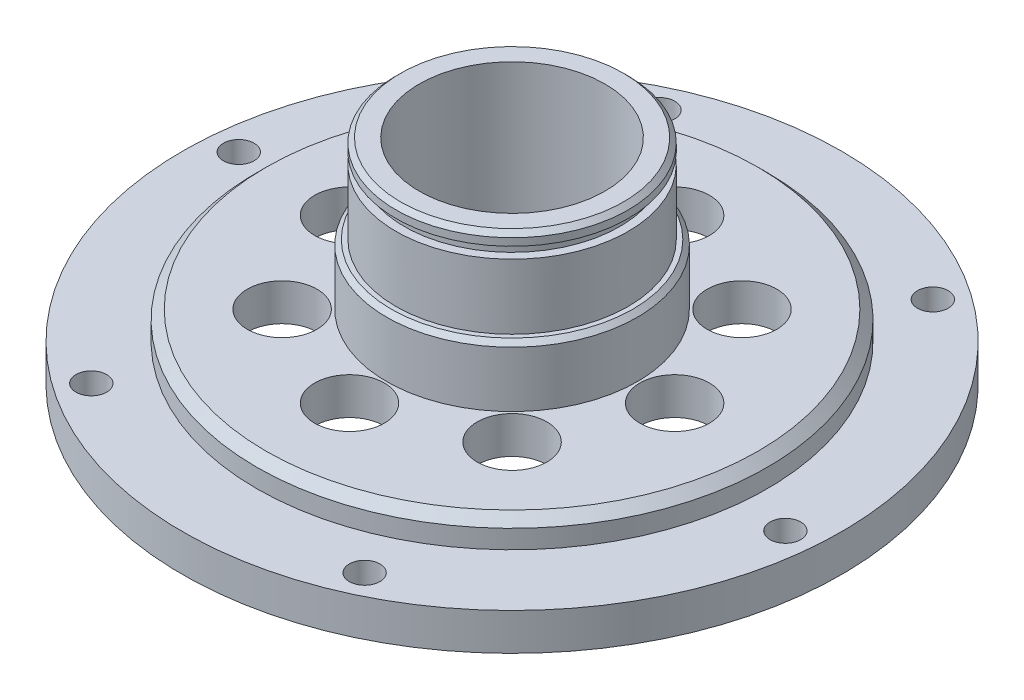
ISO-10303-21;
HEADER;
FILE_DESCRIPTION(('STEP AP214'),'2;1');
FILE_NAME('part.step','',(''),(''),'','','');
FILE_SCHEMA(('AUTOMOTIVE_DESIGN { 1 0 10303 214 1 1 1 1 }'));
ENDSEC;
DATA;
#1=APPLICATION_CONTEXT('core data for automotive mechanical design processes');
#2=APPLICATION_PROTOCOL_DEFINITION('international standard','automotive_design',2000,#1);
#3=PRODUCT_CONTEXT('',#1,'mechanical');
#4=PRODUCT('Part','Part','',(#3));
#5=PRODUCT_RELATED_PRODUCT_CATEGORY('part','',(#4));
#6=PRODUCT_DEFINITION_FORMATION('','',#4);
#7=PRODUCT_DEFINITION_CONTEXT('part definition',#1,'design');
#8=PRODUCT_DEFINITION('design','',#6,#7);
#9=PRODUCT_DEFINITION_SHAPE('','',#8);
#10=(LENGTH_UNIT() NAMED_UNIT(*) SI_UNIT(.MILLI.,.METRE.));
#11=(NAMED_UNIT(*) PLANE_ANGLE_UNIT() SI_UNIT($,.RADIAN.));
#12=(NAMED_UNIT(*) SI_UNIT($,.STERADIAN.) SOLID_ANGLE_UNIT());
#13=UNCERTAINTY_MEASURE_WITH_UNIT(LENGTH_MEASURE(1.E-05),#10,'distance_accuracy_value','');
#14=(GEOMETRIC_REPRESENTATION_CONTEXT(3) GLOBAL_UNCERTAINTY_ASSIGNED_CONTEXT((#13)) GLOBAL_UNIT_ASSIGNED_CONTEXT((#10,
#11,#12)) REPRESENTATION_CONTEXT('',''));
#15=CARTESIAN_POINT('',(0.,0.,0.));
#16=DIRECTION('',(0.,0.,1.));
#17=DIRECTION('',(1.,0.,0.));
#18=AXIS2_PLACEMENT_3D('',#15,#16,#17);
#19=CARTESIAN_POINT('',(-12.5,7.,0.));
#20=DIRECTION('',(0.,-1.,0.));
#21=DIRECTION('',(0.,0.,-1.));
#22=AXIS2_PLACEMENT_3D('',#19,#20,#21);
#23=PLANE('',#22);
#24=CARTESIAN_POINT('',(0.,7.,-17.5));
#25=DIRECTION('',(0.,1.,0.));
#26=DIRECTION('',(0.,0.,1.));
#27=AXIS2_PLACEMENT_3D('',#24,#25,#26);
#28=CIRCLE('',#27,3.75);
#29=CARTESIAN_POINT('',(0.,7.,-13.75));
#30=VERTEX_POINT('',#29);
#31=EDGE_CURVE('E116',#30,#30,#28,.T.);
#32=ORIENTED_EDGE('',*,*,#31,.F.);
#33=EDGE_LOOP('',(#32));
#34=FACE_BOUND('',#33,.T.);
#35=CARTESIAN_POINT('',(12.3743686707646,7.,-12.3743686707646));
#36=DIRECTION('',(0.,1.,0.));
#37=DIRECTION('',(0.,0.,1.));
#38=AXIS2_PLACEMENT_3D('',#35,#36,#37);
#39=CIRCLE('',#38,3.75);
#40=CARTESIAN_POINT('',(12.3743686707646,7.,-8.62436867076459));
#41=VERTEX_POINT('',#40);
#42=EDGE_CURVE('E119',#41,#41,#39,.T.);
#43=ORIENTED_EDGE('',*,*,#42,.F.);
#44=EDGE_LOOP('',(#43));
#45=FACE_BOUND('',#44,.T.);
#46=CARTESIAN_POINT('',(17.5,7.,0.));
#47=DIRECTION('',(0.,1.,0.));
#48=DIRECTION('',(0.,0.,1.));
#49=AXIS2_PLACEMENT_3D('',#46,#47,#48);
#50=CIRCLE('',#49,3.75);
#51=CARTESIAN_POINT('',(17.5,7.,3.75));
#52=VERTEX_POINT('',#51);
#53=EDGE_CURVE('E136',#52,#52,#50,.T.);
#54=ORIENTED_EDGE('',*,*,#53,.F.);
#55=EDGE_LOOP('',(#54));
#56=FACE_BOUND('',#55,.T.);
#57=CARTESIAN_POINT('',(12.3743686707646,7.,12.3743686707646));
#58=DIRECTION('',(0.,1.,0.));
#59=DIRECTION('',(0.,0.,1.));
#60=AXIS2_PLACEMENT_3D('',#57,#58,#59);
#61=CIRCLE('',#60,3.75);
#62=CARTESIAN_POINT('',(12.3743686707646,7.,16.1243686707646));
#63=VERTEX_POINT('',#62);
#64=EDGE_CURVE('E133',#63,#63,#61,.T.);
#65=ORIENTED_EDGE('',*,*,#64,.F.);
#66=EDGE_LOOP('',(#65));
#67=FACE_BOUND('',#66,.T.);
#68=CARTESIAN_POINT('',(0.,7.,17.5));
#69=DIRECTION('',(0.,1.,0.));
#70=DIRECTION('',(0.,0.,1.));
#71=AXIS2_PLACEMENT_3D('',#68,#69,#70);
#72=CIRCLE('',#71,3.75);
#73=CARTESIAN_POINT('',(0.,7.,21.25));
#74=VERTEX_POINT('',#73);
#75=EDGE_CURVE('E130',#74,#74,#72,.T.);
#76=ORIENTED_EDGE('',*,*,#75,.F.);
#77=EDGE_LOOP('',(#76));
#78=FACE_BOUND('',#77,.T.);
#79=CARTESIAN_POINT('',(-12.3743686707646,7.,12.3743686707646));
#80=DIRECTION('',(0.,1.,0.));
#81=DIRECTION('',(0.,0.,1.));
#82=AXIS2_PLACEMENT_3D('',#79,#80,#81);
#83=CIRCLE('',#82,3.75);
#84=CARTESIAN_POINT('',(-12.3743686707646,7.,16.1243686707646));
#85=VERTEX_POINT('',#84);
#86=EDGE_CURVE('E127',#85,#85,#83,.T.);
#87=ORIENTED_EDGE('',*,*,#86,.F.);
#88=EDGE_LOOP('',(#87));
#89=FACE_BOUND('',#88,.T.);
#90=CARTESIAN_POINT('',(-17.5,7.,0.));
#91=DIRECTION('',(0.,1.,0.));
#92=DIRECTION('',(0.,0.,1.));
#93=AXIS2_PLACEMENT_3D('',#90,#91,#92);
#94=CIRCLE('',#93,3.75);
#95=CARTESIAN_POINT('',(-17.5,7.,3.75));
#96=VERTEX_POINT('',#95);
#97=EDGE_CURVE('E123',#96,#96,#94,.T.);
#98=ORIENTED_EDGE('',*,*,#97,.F.);
#99=EDGE_LOOP('',(#98));
#100=FACE_BOUND('',#99,.T.);
#101=CARTESIAN_POINT('',(-12.3743686707646,7.,-12.3743686707646));
#102=DIRECTION('',(0.,1.,0.));
#103=DIRECTION('',(0.,0.,1.));
#104=AXIS2_PLACEMENT_3D('',#101,#102,#103);
#105=CIRCLE('',#104,3.75);
#106=CARTESIAN_POINT('',(-12.3743686707646,7.,-8.62436867076458));
#107=VERTEX_POINT('',#106);
#108=EDGE_CURVE('E120',#107,#107,#105,.T.);
#109=ORIENTED_EDGE('',*,*,#108,.F.);
#110=EDGE_LOOP('',(#109));
#111=FACE_BOUND('',#110,.T.);
#112=CARTESIAN_POINT('',(0.,7.,0.));
#113=DIRECTION('',(0.,-1.,0.));
#114=DIRECTION('',(0.,0.,-1.));
#115=AXIS2_PLACEMENT_3D('',#112,#113,#114);
#116=CIRCLE('',#115,26.475);
#117=CARTESIAN_POINT('',(0.,7.,-26.475));
#118=VERTEX_POINT('',#117);
#119=EDGE_CURVE('E62',#118,#118,#116,.F.);
#120=ORIENTED_EDGE('',*,*,#119,.T.);
#121=EDGE_LOOP('',(#120));
#122=FACE_BOUND('',#121,.T.);
#123=CARTESIAN_POINT('',(0.,7.,0.));
#124=DIRECTION('',(0.,-1.,0.));
#125=DIRECTION('',(0.,0.,-1.));
#126=AXIS2_PLACEMENT_3D('',#123,#124,#125);
#127=CIRCLE('',#126,13.5);
#128=CARTESIAN_POINT('',(0.,7.,-13.5));
#129=VERTEX_POINT('',#128);
#130=EDGE_CURVE('E50',#129,#129,#127,.F.);
#131=ORIENTED_EDGE('',*,*,#130,.F.);
#132=EDGE_LOOP('',(#131));
#133=FACE_BOUND('',#132,.T.);
#134=ADVANCED_FACE('F38',(#34,#45,#56,#67,#78,#89,#100,#111,#122,#133),#23,.F.);
#135=CARTESIAN_POINT('',(0.,0.,0.));
#136=DIRECTION('',(0.,-1.,0.));
#137=DIRECTION('',(0.,0.,-1.));
#138=AXIS2_PLACEMENT_3D('',#135,#136,#137);
#139=CYLINDRICAL_SURFACE('',#138,12.5);
#140=CARTESIAN_POINT('',(0.,22.5,0.));
#141=DIRECTION('',(0.,-1.,0.));
#142=DIRECTION('',(0.,0.,-1.));
#143=AXIS2_PLACEMENT_3D('',#140,#141,#142);
#144=CIRCLE('',#143,12.5);
#145=CARTESIAN_POINT('',(0.,22.5,-12.5));
#146=VERTEX_POINT('',#145);
#147=EDGE_CURVE('E59',#146,#146,#144,.T.);
#148=ORIENTED_EDGE('',*,*,#147,.T.);
#149=EDGE_LOOP('',(#148));
#150=FACE_BOUND('',#149,.T.);
#151=CARTESIAN_POINT('',(0.,21.7,0.));
#152=DIRECTION('',(0.,-1.,0.));
#153=DIRECTION('',(0.,0.,-1.));
#154=AXIS2_PLACEMENT_3D('',#151,#152,#153);
#155=CIRCLE('',#154,12.5);
#156=CARTESIAN_POINT('',(0.,21.7,-12.5));
#157=VERTEX_POINT('',#156);
#158=EDGE_CURVE('E124',#157,#157,#155,.T.);
#159=ORIENTED_EDGE('',*,*,#158,.F.);
#160=EDGE_LOOP('',(#159));
#161=FACE_BOUND('',#160,.T.);
#162=ADVANCED_FACE('F209',(#150,#161),#139,.T.);
#163=CARTESIAN_POINT('',(0.,0.,0.));
#164=DIRECTION('',(0.,-1.,0.));
#165=DIRECTION('',(0.,0.,-1.));
#166=AXIS2_PLACEMENT_3D('',#163,#164,#165);
#167=CYLINDRICAL_SURFACE('',#166,35.475);
#168=CARTESIAN_POINT('',(0.,0.,0.));
#169=DIRECTION('',(0.,-1.,0.));
#170=DIRECTION('',(0.,0.,-1.));
#171=AXIS2_PLACEMENT_3D('',#168,#169,#170);
#172=CIRCLE('',#171,35.475);
#173=CARTESIAN_POINT('',(0.,0.,-35.475));
#174=VERTEX_POINT('',#173);
#175=EDGE_CURVE('E74',#174,#174,#172,.T.);
#176=ORIENTED_EDGE('',*,*,#175,.F.);
#177=EDGE_LOOP('',(#176));
#178=FACE_BOUND('',#177,.T.);
#179=CARTESIAN_POINT('',(0.,4.,0.));
#180=DIRECTION('',(0.,-1.,0.));
#181=DIRECTION('',(0.,0.,-1.));
#182=AXIS2_PLACEMENT_3D('',#179,#180,#181);
#183=CIRCLE('',#182,35.475);
#184=CARTESIAN_POINT('',(0.,4.,-35.475));
#185=VERTEX_POINT('',#184);
#186=EDGE_CURVE('E89',#185,#185,#183,.T.);
#187=ORIENTED_EDGE('',*,*,#186,.T.);
#188=EDGE_LOOP('',(#187));
#189=FACE_BOUND('',#188,.T.);
#190=ADVANCED_FACE('F215',(#178,#189),#167,.T.);
#191=CARTESIAN_POINT('',(-35.475,0.,0.));
#192=DIRECTION('',(0.,1.,0.));
#193=DIRECTION('',(0.,0.,1.));
#194=AXIS2_PLACEMENT_3D('',#191,#192,#193);
#195=PLANE('',#194);
#196=CARTESIAN_POINT('',(-13.6313857115531,0.,-29.503140910467));
#197=DIRECTION('',(0.,1.,0.));
#198=DIRECTION('',(0.,0.,1.));
#199=AXIS2_PLACEMENT_3D('',#196,#197,#198);
#200=CIRCLE('',#199,1.65);
#201=CARTESIAN_POINT('',(-13.6313857115531,0.,-27.853140910467));
#202=VERTEX_POINT('',#201);
#203=EDGE_CURVE('E182',#202,#202,#200,.T.);
#204=ORIENTED_EDGE('',*,*,#203,.T.);
#205=EDGE_LOOP('',(#204));
#206=FACE_BOUND('',#205,.T.);
#207=CARTESIAN_POINT('',(-32.3661623756729,0.,-2.9464441402442));
#208=DIRECTION('',(0.,1.,0.));
#209=DIRECTION('',(0.,0.,1.));
#210=AXIS2_PLACEMENT_3D('',#207,#208,#209);
#211=CIRCLE('',#210,1.65);
#212=CARTESIAN_POINT('',(-32.3661623756729,0.,-1.2964441402442));
#213=VERTEX_POINT('',#212);
#214=EDGE_CURVE('E176',#213,#213,#211,.T.);
#215=ORIENTED_EDGE('',*,*,#214,.T.);
#216=EDGE_LOOP('',(#215));
#217=FACE_BOUND('',#216,.T.);
#218=CARTESIAN_POINT('',(-18.7347766641195,0.,26.5566967702229));
#219=DIRECTION('',(0.,1.,0.));
#220=DIRECTION('',(0.,0.,1.));
#221=AXIS2_PLACEMENT_3D('',#218,#219,#220);
#222=CIRCLE('',#221,1.65);
#223=CARTESIAN_POINT('',(-18.7347766641195,0.,28.2066967702229));
#224=VERTEX_POINT('',#223);
#225=EDGE_CURVE('E170',#224,#224,#222,.T.);
#226=ORIENTED_EDGE('',*,*,#225,.T.);
#227=EDGE_LOOP('',(#226));
#228=FACE_BOUND('',#227,.T.);
#229=CARTESIAN_POINT('',(13.6313857115533,0.,29.5031409104669));
#230=DIRECTION('',(0.,1.,0.));
#231=DIRECTION('',(0.,0.,1.));
#232=AXIS2_PLACEMENT_3D('',#229,#230,#231);
#233=CIRCLE('',#232,1.65);
#234=CARTESIAN_POINT('',(13.6313857115533,0.,31.1531409104669));
#235=VERTEX_POINT('',#234);
#236=EDGE_CURVE('E164',#235,#235,#233,.T.);
#237=ORIENTED_EDGE('',*,*,#236,.T.);
#238=EDGE_LOOP('',(#237));
#239=FACE_BOUND('',#238,.T.);
#240=CARTESIAN_POINT('',(32.3661623756729,0.,2.94644414024398));
#241=DIRECTION('',(0.,1.,0.));
#242=DIRECTION('',(0.,0.,1.));
#243=AXIS2_PLACEMENT_3D('',#240,#241,#242);
#244=CIRCLE('',#243,1.65);
#245=CARTESIAN_POINT('',(32.3661623756729,0.,4.59644414024398));
#246=VERTEX_POINT('',#245);
#247=EDGE_CURVE('E158',#246,#246,#244,.T.);
#248=ORIENTED_EDGE('',*,*,#247,.T.);
#249=EDGE_LOOP('',(#248));
#250=FACE_BOUND('',#249,.T.);
#251=CARTESIAN_POINT('',(18.7347766641195,0.,-26.5566967702229));
#252=DIRECTION('',(0.,1.,0.));
#253=DIRECTION('',(0.,0.,1.));
#254=AXIS2_PLACEMENT_3D('',#251,#252,#253);
#255=CIRCLE('',#254,1.65);
#256=CARTESIAN_POINT('',(18.7347766641195,0.,-24.9066967702229));
#257=VERTEX_POINT('',#256);
#258=EDGE_CURVE('E152',#257,#257,#255,.T.);
#259=ORIENTED_EDGE('',*,*,#258,.T.);
#260=EDGE_LOOP('',(#259));
#261=FACE_BOUND('',#260,.T.);
#262=CARTESIAN_POINT('',(0.,0.,0.));
#263=DIRECTION('',(0.,1.,0.));
#264=DIRECTION('',(0.,0.,1.));
#265=AXIS2_PLACEMENT_3D('',#262,#263,#264);
#266=CIRCLE('',#265,24.475);
#267=CARTESIAN_POINT('',(0.,0.,24.475));
#268=VERTEX_POINT('',#267);
#269=EDGE_CURVE('E68',#268,#268,#266,.T.);
#270=ORIENTED_EDGE('',*,*,#269,.T.);
#271=EDGE_LOOP('',(#270));
#272=FACE_BOUND('',#271,.T.);
#273=ORIENTED_EDGE('',*,*,#175,.T.);
#274=EDGE_LOOP('',(#273));
#275=FACE_BOUND('',#274,.T.);
#276=ADVANCED_FACE('F240',(#206,#217,#228,#239,#250,#261,#272,#275),#195,.F.);
#277=CARTESIAN_POINT('',(0.,0.,0.));
#278=DIRECTION('',(0.,-1.,0.));
#279=DIRECTION('',(0.,0.,-1.));
#280=AXIS2_PLACEMENT_3D('',#277,#278,#279);
#281=CYLINDRICAL_SURFACE('',#280,23.475);
#282=CARTESIAN_POINT('',(0.,0.99999999999998,0.));
#283=DIRECTION('',(0.,1.,0.));
#284=DIRECTION('',(0.,0.,1.));
#285=AXIS2_PLACEMENT_3D('',#282,#283,#284);
#286=CIRCLE('',#285,23.475);
#287=CARTESIAN_POINT('',(0.,0.99999999999998,23.475));
#288=VERTEX_POINT('',#287);
#289=EDGE_CURVE('E71',#288,#288,#286,.F.);
#290=ORIENTED_EDGE('',*,*,#289,.T.);
#291=EDGE_LOOP('',(#290));
#292=FACE_BOUND('',#291,.T.);
#293=CARTESIAN_POINT('',(0.,3.,0.));
#294=DIRECTION('',(0.,-1.,0.));
#295=DIRECTION('',(0.,0.,-1.));
#296=AXIS2_PLACEMENT_3D('',#293,#294,#295);
#297=CIRCLE('',#296,23.475);
#298=CARTESIAN_POINT('',(0.,3.,-23.475));
#299=VERTEX_POINT('',#298);
#300=EDGE_CURVE('E77',#299,#299,#297,.T.);
#301=ORIENTED_EDGE('',*,*,#300,.F.);
#302=EDGE_LOOP('',(#301));
#303=FACE_BOUND('',#302,.T.);
#304=ADVANCED_FACE('F236',(#292,#303),#281,.F.);
#305=CARTESIAN_POINT('',(-23.475,3.,0.));
#306=DIRECTION('',(0.,1.,0.));
#307=DIRECTION('',(0.,0.,1.));
#308=AXIS2_PLACEMENT_3D('',#305,#306,#307);
#309=PLANE('',#308);
#310=CARTESIAN_POINT('',(-12.3743686707646,3.,-12.3743686707646));
#311=DIRECTION('',(0.,1.,0.));
#312=DIRECTION('',(0.,0.,1.));
#313=AXIS2_PLACEMENT_3D('',#310,#311,#312);
#314=CIRCLE('',#313,3.75);
#315=CARTESIAN_POINT('',(-12.3743686707646,3.,-8.62436867076458));
#316=VERTEX_POINT('',#315);
#317=EDGE_CURVE('E92',#316,#316,#314,.T.);
#318=ORIENTED_EDGE('',*,*,#317,.T.);
#319=EDGE_LOOP('',(#318));
#320=FACE_BOUND('',#319,.T.);
#321=CARTESIAN_POINT('',(-17.5,3.,0.));
#322=DIRECTION('',(0.,1.,0.));
#323=DIRECTION('',(0.,0.,1.));
#324=AXIS2_PLACEMENT_3D('',#321,#322,#323);
#325=CIRCLE('',#324,3.75);
#326=CARTESIAN_POINT('',(-17.5,3.,3.75));
#327=VERTEX_POINT('',#326);
#328=EDGE_CURVE('E95',#327,#327,#325,.T.);
#329=ORIENTED_EDGE('',*,*,#328,.T.);
#330=EDGE_LOOP('',(#329));
#331=FACE_BOUND('',#330,.T.);
#332=CARTESIAN_POINT('',(-12.3743686707646,3.,12.3743686707646));
#333=DIRECTION('',(0.,1.,0.));
#334=DIRECTION('',(0.,0.,1.));
#335=AXIS2_PLACEMENT_3D('',#332,#333,#334);
#336=CIRCLE('',#335,3.75);
#337=CARTESIAN_POINT('',(-12.3743686707646,3.,16.1243686707646));
#338=VERTEX_POINT('',#337);
#339=EDGE_CURVE('E98',#338,#338,#336,.T.);
#340=ORIENTED_EDGE('',*,*,#339,.T.);
#341=EDGE_LOOP('',(#340));
#342=FACE_BOUND('',#341,.T.);
#343=CARTESIAN_POINT('',(0.,3.,17.5));
#344=DIRECTION('',(0.,1.,0.));
#345=DIRECTION('',(0.,0.,1.));
#346=AXIS2_PLACEMENT_3D('',#343,#344,#345);
#347=CIRCLE('',#346,3.75);
#348=CARTESIAN_POINT('',(0.,3.,21.25));
#349=VERTEX_POINT('',#348);
#350=EDGE_CURVE('E101',#349,#349,#347,.T.);
#351=ORIENTED_EDGE('',*,*,#350,.T.);
#352=EDGE_LOOP('',(#351));
#353=FACE_BOUND('',#352,.T.);
#354=CARTESIAN_POINT('',(12.3743686707646,3.,12.3743686707646));
#355=DIRECTION('',(0.,1.,0.));
#356=DIRECTION('',(0.,0.,1.));
#357=AXIS2_PLACEMENT_3D('',#354,#355,#356);
#358=CIRCLE('',#357,3.75);
#359=CARTESIAN_POINT('',(12.3743686707646,3.,16.1243686707646));
#360=VERTEX_POINT('',#359);
#361=EDGE_CURVE('E104',#360,#360,#358,.T.);
#362=ORIENTED_EDGE('',*,*,#361,.T.);
#363=EDGE_LOOP('',(#362));
#364=FACE_BOUND('',#363,.T.);
#365=CARTESIAN_POINT('',(17.5,3.,0.));
#366=DIRECTION('',(0.,1.,0.));
#367=DIRECTION('',(0.,0.,1.));
#368=AXIS2_PLACEMENT_3D('',#365,#366,#367);
#369=CIRCLE('',#368,3.75);
#370=CARTESIAN_POINT('',(17.5,3.,3.75));
#371=VERTEX_POINT('',#370);
#372=EDGE_CURVE('E107',#371,#371,#369,.T.);
#373=ORIENTED_EDGE('',*,*,#372,.T.);
#374=EDGE_LOOP('',(#373));
#375=FACE_BOUND('',#374,.T.);
#376=CARTESIAN_POINT('',(12.3743686707646,3.,-12.3743686707646));
#377=DIRECTION('',(0.,1.,0.));
#378=DIRECTION('',(0.,0.,1.));
#379=AXIS2_PLACEMENT_3D('',#376,#377,#378);
#380=CIRCLE('',#379,3.75);
#381=CARTESIAN_POINT('',(12.3743686707646,3.,-8.62436867076459));
#382=VERTEX_POINT('',#381);
#383=EDGE_CURVE('E110',#382,#382,#380,.T.);
#384=ORIENTED_EDGE('',*,*,#383,.T.);
#385=EDGE_LOOP('',(#384));
#386=FACE_BOUND('',#385,.T.);
#387=CARTESIAN_POINT('',(0.,3.,-17.5));
#388=DIRECTION('',(0.,1.,0.));
#389=DIRECTION('',(0.,0.,1.));
#390=AXIS2_PLACEMENT_3D('',#387,#388,#389);
#391=CIRCLE('',#390,3.75);
#392=CARTESIAN_POINT('',(0.,3.,-13.75));
#393=VERTEX_POINT('',#392);
#394=EDGE_CURVE('E113',#393,#393,#391,.T.);
#395=ORIENTED_EDGE('',*,*,#394,.T.);
#396=EDGE_LOOP('',(#395));
#397=FACE_BOUND('',#396,.T.);
#398=CARTESIAN_POINT('',(0.,3.,0.));
#399=DIRECTION('',(0.,-1.,0.));
#400=DIRECTION('',(0.,0.,-1.));
#401=AXIS2_PLACEMENT_3D('',#398,#399,#400);
#402=CIRCLE('',#401,10.);
#403=CARTESIAN_POINT('',(0.,3.,-10.));
#404=VERTEX_POINT('',#403);
#405=EDGE_CURVE('E80',#404,#404,#402,.T.);
#406=ORIENTED_EDGE('',*,*,#405,.F.);
#407=EDGE_LOOP('',(#406));
#408=FACE_BOUND('',#407,.T.);
#409=ORIENTED_EDGE('',*,*,#300,.T.);
#410=EDGE_LOOP('',(#409));
#411=FACE_BOUND('',#410,.T.);
#412=ADVANCED_FACE('F232',(#320,#331,#342,#353,#364,#375,#386,#397,#408,#411),#309,.F.);
#413=CARTESIAN_POINT('',(0.,0.,0.));
#414=DIRECTION('',(0.,-1.,0.));
#415=DIRECTION('',(0.,0.,-1.));
#416=AXIS2_PLACEMENT_3D('',#413,#414,#415);
#417=CYLINDRICAL_SURFACE('',#416,10.);
#418=CARTESIAN_POINT('',(0.,23.,0.));
#419=DIRECTION('',(0.,-1.,0.));
#420=DIRECTION('',(0.,0.,-1.));
#421=AXIS2_PLACEMENT_3D('',#418,#419,#420);
#422=CIRCLE('',#421,10.);
#423=CARTESIAN_POINT('',(0.,23.,-10.));
#424=VERTEX_POINT('',#423);
#425=EDGE_CURVE('E83',#424,#424,#422,.T.);
#426=ORIENTED_EDGE('',*,*,#425,.F.);
#427=EDGE_LOOP('',(#426));
#428=FACE_BOUND('',#427,.T.);
#429=ORIENTED_EDGE('',*,*,#405,.T.);
#430=EDGE_LOOP('',(#429));
#431=FACE_BOUND('',#430,.T.);
#432=ADVANCED_FACE('F228',(#428,#431),#417,.F.);
#433=CARTESIAN_POINT('',(-10.,23.,0.));
#434=DIRECTION('',(0.,-1.,0.));
#435=DIRECTION('',(0.,0.,-1.));
#436=AXIS2_PLACEMENT_3D('',#433,#434,#435);
#437=PLANE('',#436);
#438=CARTESIAN_POINT('',(0.,23.,0.));
#439=DIRECTION('',(0.,-1.,0.));
#440=DIRECTION('',(0.,0.,-1.));
#441=AXIS2_PLACEMENT_3D('',#438,#439,#440);
#442=CIRCLE('',#441,12.);
#443=CARTESIAN_POINT('',(0.,23.,-12.));
#444=VERTEX_POINT('',#443);
#445=EDGE_CURVE('E54',#444,#444,#442,.F.);
#446=ORIENTED_EDGE('',*,*,#445,.T.);
#447=EDGE_LOOP('',(#446));
#448=FACE_BOUND('',#447,.T.);
#449=ORIENTED_EDGE('',*,*,#425,.T.);
#450=EDGE_LOOP('',(#449));
#451=FACE_BOUND('',#450,.T.);
#452=ADVANCED_FACE('F225',(#448,#451),#437,.F.);
#453=CARTESIAN_POINT('',(0.,13.5,0.));
#454=DIRECTION('',(0.,1.,0.));
#455=DIRECTION('',(0.,0.,1.));
#456=AXIS2_PLACEMENT_3D('',#453,#454,#455);
#457=CIRCLE('',#456,12.5);
#458=CARTESIAN_POINT('',(0.,13.5,12.5));
#459=VERTEX_POINT('',#458);
#460=EDGE_CURVE('E188',#459,#459,#457,.T.);
#461=ORIENTED_EDGE('',*,*,#460,.T.);
#462=EDGE_LOOP('',(#461));
#463=FACE_BOUND('',#462,.T.);
#464=CARTESIAN_POINT('',(0.,20.5,0.));
#465=DIRECTION('',(0.,-1.,0.));
#466=DIRECTION('',(0.,0.,-1.));
#467=AXIS2_PLACEMENT_3D('',#464,#465,#466);
#468=CIRCLE('',#467,12.5);
#469=CARTESIAN_POINT('',(0.,20.5,-12.5));
#470=VERTEX_POINT('',#469);
#471=EDGE_CURVE('E149',#470,#470,#468,.T.);
#472=ORIENTED_EDGE('',*,*,#471,.T.);
#473=EDGE_LOOP('',(#472));
#474=FACE_BOUND('',#473,.T.);
#475=ADVANCED_FACE('F192',(#463,#474),#139,.T.);
#476=CARTESIAN_POINT('',(0.,0.,0.));
#477=DIRECTION('',(0.,-1.,0.));
#478=DIRECTION('',(0.,0.,-1.));
#479=AXIS2_PLACEMENT_3D('',#476,#477,#478);
#480=CYLINDRICAL_SURFACE('',#479,27.475);
#481=CARTESIAN_POINT('',(0.,5.99999999999999,0.));
#482=DIRECTION('',(0.,-1.,0.));
#483=DIRECTION('',(0.,0.,-1.));
#484=AXIS2_PLACEMENT_3D('',#481,#482,#483);
#485=CIRCLE('',#484,27.475);
#486=CARTESIAN_POINT('',(0.,5.99999999999999,-27.475));
#487=VERTEX_POINT('',#486);
#488=EDGE_CURVE('E65',#487,#487,#485,.T.);
#489=ORIENTED_EDGE('',*,*,#488,.T.);
#490=EDGE_LOOP('',(#489));
#491=FACE_BOUND('',#490,.T.);
#492=CARTESIAN_POINT('',(0.,4.,0.));
#493=DIRECTION('',(0.,-1.,0.));
#494=DIRECTION('',(0.,0.,-1.));
#495=AXIS2_PLACEMENT_3D('',#492,#493,#494);
#496=CIRCLE('',#495,27.475);
#497=CARTESIAN_POINT('',(0.,4.,-27.475));
#498=VERTEX_POINT('',#497);
#499=EDGE_CURVE('E86',#498,#498,#496,.T.);
#500=ORIENTED_EDGE('',*,*,#499,.F.);
#501=EDGE_LOOP('',(#500));
#502=FACE_BOUND('',#501,.T.);
#503=ADVANCED_FACE('F221',(#491,#502),#480,.T.);
#504=CARTESIAN_POINT('',(-27.475,4.,0.));
#505=DIRECTION('',(0.,-1.,0.));
#506=DIRECTION('',(0.,0.,-1.));
#507=AXIS2_PLACEMENT_3D('',#504,#505,#506);
#508=PLANE('',#507);
#509=CARTESIAN_POINT('',(-13.6313857115531,4.,-29.503140910467));
#510=DIRECTION('',(0.,1.,0.));
#511=DIRECTION('',(0.,0.,1.));
#512=AXIS2_PLACEMENT_3D('',#509,#510,#511);
#513=CIRCLE('',#512,1.65);
#514=CARTESIAN_POINT('',(-13.6313857115531,4.,-27.853140910467));
#515=VERTEX_POINT('',#514);
#516=EDGE_CURVE('E185',#515,#515,#513,.T.);
#517=ORIENTED_EDGE('',*,*,#516,.F.);
#518=EDGE_LOOP('',(#517));
#519=FACE_BOUND('',#518,.T.);
#520=CARTESIAN_POINT('',(-32.3661623756729,4.,-2.9464441402442));
#521=DIRECTION('',(0.,1.,0.));
#522=DIRECTION('',(0.,0.,1.));
#523=AXIS2_PLACEMENT_3D('',#520,#521,#522);
#524=CIRCLE('',#523,1.65);
#525=CARTESIAN_POINT('',(-32.3661623756729,4.,-1.2964441402442));
#526=VERTEX_POINT('',#525);
#527=EDGE_CURVE('E179',#526,#526,#524,.T.);
#528=ORIENTED_EDGE('',*,*,#527,.F.);
#529=EDGE_LOOP('',(#528));
#530=FACE_BOUND('',#529,.T.);
#531=CARTESIAN_POINT('',(-18.7347766641195,4.,26.5566967702229));
#532=DIRECTION('',(0.,1.,0.));
#533=DIRECTION('',(0.,0.,1.));
#534=AXIS2_PLACEMENT_3D('',#531,#532,#533);
#535=CIRCLE('',#534,1.65);
#536=CARTESIAN_POINT('',(-18.7347766641195,4.,28.2066967702229));
#537=VERTEX_POINT('',#536);
#538=EDGE_CURVE('E173',#537,#537,#535,.T.);
#539=ORIENTED_EDGE('',*,*,#538,.F.);
#540=EDGE_LOOP('',(#539));
#541=FACE_BOUND('',#540,.T.);
#542=CARTESIAN_POINT('',(13.6313857115533,4.,29.5031409104669));
#543=DIRECTION('',(0.,1.,0.));
#544=DIRECTION('',(0.,0.,1.));
#545=AXIS2_PLACEMENT_3D('',#542,#543,#544);
#546=CIRCLE('',#545,1.65);
#547=CARTESIAN_POINT('',(13.6313857115533,4.,31.1531409104669));
#548=VERTEX_POINT('',#547);
#549=EDGE_CURVE('E167',#548,#548,#546,.T.);
#550=ORIENTED_EDGE('',*,*,#549,.F.);
#551=EDGE_LOOP('',(#550));
#552=FACE_BOUND('',#551,.T.);
#553=CARTESIAN_POINT('',(32.3661623756729,4.,2.94644414024398));
#554=DIRECTION('',(0.,1.,0.));
#555=DIRECTION('',(0.,0.,1.));
#556=AXIS2_PLACEMENT_3D('',#553,#554,#555);
#557=CIRCLE('',#556,1.65);
#558=CARTESIAN_POINT('',(32.3661623756729,4.,4.59644414024398));
#559=VERTEX_POINT('',#558);
#560=EDGE_CURVE('E161',#559,#559,#557,.T.);
#561=ORIENTED_EDGE('',*,*,#560,.F.);
#562=EDGE_LOOP('',(#561));
#563=FACE_BOUND('',#562,.T.);
#564=CARTESIAN_POINT('',(18.7347766641195,4.,-26.5566967702229));
#565=DIRECTION('',(0.,1.,0.));
#566=DIRECTION('',(0.,0.,1.));
#567=AXIS2_PLACEMENT_3D('',#564,#565,#566);
#568=CIRCLE('',#567,1.65);
#569=CARTESIAN_POINT('',(18.7347766641195,4.,-24.9066967702229));
#570=VERTEX_POINT('',#569);
#571=EDGE_CURVE('E155',#570,#570,#568,.T.);
#572=ORIENTED_EDGE('',*,*,#571,.F.);
#573=EDGE_LOOP('',(#572));
#574=FACE_BOUND('',#573,.T.);
#575=ORIENTED_EDGE('',*,*,#186,.F.);
#576=EDGE_LOOP('',(#575));
#577=FACE_BOUND('',#576,.T.);
#578=ORIENTED_EDGE('',*,*,#499,.T.);
#579=EDGE_LOOP('',(#578));
#580=FACE_BOUND('',#579,.T.);
#581=ADVANCED_FACE('F326',(#519,#530,#541,#552,#563,#574,#577,#580),#508,.F.);
#582=CARTESIAN_POINT('',(0.,-3.,-17.5));
#583=DIRECTION('',(0.,1.,0.));
#584=DIRECTION('',(0.,0.,1.));
#585=AXIS2_PLACEMENT_3D('',#582,#583,#584);
#586=CYLINDRICAL_SURFACE('',#585,3.75);
#587=ORIENTED_EDGE('',*,*,#31,.T.);
#588=EDGE_LOOP('',(#587));
#589=FACE_BOUND('',#588,.T.);
#590=ORIENTED_EDGE('',*,*,#394,.F.);
#591=EDGE_LOOP('',(#590));
#592=FACE_BOUND('',#591,.T.);
#593=ADVANCED_FACE('F301',(#589,#592),#586,.F.);
#594=CARTESIAN_POINT('',(12.3743686707646,-3.,-12.3743686707646));
#595=DIRECTION('',(0.,1.,0.));
#596=DIRECTION('',(0.,0.,1.));
#597=AXIS2_PLACEMENT_3D('',#594,#595,#596);
#598=CYLINDRICAL_SURFACE('',#597,3.75);
#599=ORIENTED_EDGE('',*,*,#42,.T.);
#600=EDGE_LOOP('',(#599));
#601=FACE_BOUND('',#600,.T.);
#602=ORIENTED_EDGE('',*,*,#383,.F.);
#603=EDGE_LOOP('',(#602));
#604=FACE_BOUND('',#603,.T.);
#605=ADVANCED_FACE('F297',(#601,#604),#598,.F.);
#606=CARTESIAN_POINT('',(17.5,-3.,0.));
#607=DIRECTION('',(0.,1.,0.));
#608=DIRECTION('',(0.,0.,1.));
#609=AXIS2_PLACEMENT_3D('',#606,#607,#608);
#610=CYLINDRICAL_SURFACE('',#609,3.75);
#611=ORIENTED_EDGE('',*,*,#53,.T.);
#612=EDGE_LOOP('',(#611));
#613=FACE_BOUND('',#612,.T.);
#614=ORIENTED_EDGE('',*,*,#372,.F.);
#615=EDGE_LOOP('',(#614));
#616=FACE_BOUND('',#615,.T.);
#617=ADVANCED_FACE('F300',(#613,#616),#610,.F.);
#618=CARTESIAN_POINT('',(12.3743686707646,-3.,12.3743686707646));
#619=DIRECTION('',(0.,1.,0.));
#620=DIRECTION('',(0.,0.,1.));
#621=AXIS2_PLACEMENT_3D('',#618,#619,#620);
#622=CYLINDRICAL_SURFACE('',#621,3.75);
#623=ORIENTED_EDGE('',*,*,#64,.T.);
#624=EDGE_LOOP('',(#623));
#625=FACE_BOUND('',#624,.T.);
#626=ORIENTED_EDGE('',*,*,#361,.F.);
#627=EDGE_LOOP('',(#626));
#628=FACE_BOUND('',#627,.T.);
#629=ADVANCED_FACE('F305',(#625,#628),#622,.F.);
#630=CARTESIAN_POINT('',(0.,-3.,17.5));
#631=DIRECTION('',(0.,1.,0.));
#632=DIRECTION('',(0.,0.,1.));
#633=AXIS2_PLACEMENT_3D('',#630,#631,#632);
#634=CYLINDRICAL_SURFACE('',#633,3.75);
#635=ORIENTED_EDGE('',*,*,#75,.T.);
#636=EDGE_LOOP('',(#635));
#637=FACE_BOUND('',#636,.T.);
#638=ORIENTED_EDGE('',*,*,#350,.F.);
#639=EDGE_LOOP('',(#638));
#640=FACE_BOUND('',#639,.T.);
#641=ADVANCED_FACE('F309',(#637,#640),#634,.F.);
#642=CARTESIAN_POINT('',(-12.3743686707646,-3.,12.3743686707646));
#643=DIRECTION('',(0.,1.,0.));
#644=DIRECTION('',(0.,0.,1.));
#645=AXIS2_PLACEMENT_3D('',#642,#643,#644);
#646=CYLINDRICAL_SURFACE('',#645,3.75);
#647=ORIENTED_EDGE('',*,*,#86,.T.);
#648=EDGE_LOOP('',(#647));
#649=FACE_BOUND('',#648,.T.);
#650=ORIENTED_EDGE('',*,*,#339,.F.);
#651=EDGE_LOOP('',(#650));
#652=FACE_BOUND('',#651,.T.);
#653=ADVANCED_FACE('F313',(#649,#652),#646,.F.);
#654=CARTESIAN_POINT('',(-17.5,-3.,0.));
#655=DIRECTION('',(0.,1.,0.));
#656=DIRECTION('',(0.,0.,1.));
#657=AXIS2_PLACEMENT_3D('',#654,#655,#656);
#658=CYLINDRICAL_SURFACE('',#657,3.75);
#659=ORIENTED_EDGE('',*,*,#97,.T.);
#660=EDGE_LOOP('',(#659));
#661=FACE_BOUND('',#660,.T.);
#662=ORIENTED_EDGE('',*,*,#328,.F.);
#663=EDGE_LOOP('',(#662));
#664=FACE_BOUND('',#663,.T.);
#665=ADVANCED_FACE('F317',(#661,#664),#658,.F.);
#666=CARTESIAN_POINT('',(-12.3743686707646,-3.,-12.3743686707646));
#667=DIRECTION('',(0.,1.,0.));
#668=DIRECTION('',(0.,0.,1.));
#669=AXIS2_PLACEMENT_3D('',#666,#667,#668);
#670=CYLINDRICAL_SURFACE('',#669,3.75);
#671=ORIENTED_EDGE('',*,*,#108,.T.);
#672=EDGE_LOOP('',(#671));
#673=FACE_BOUND('',#672,.T.);
#674=ORIENTED_EDGE('',*,*,#317,.F.);
#675=EDGE_LOOP('',(#674));
#676=FACE_BOUND('',#675,.T.);
#677=ADVANCED_FACE('F256',(#673,#676),#670,.F.);
#678=CARTESIAN_POINT('',(0.,0.99999999999998,0.));
#679=DIRECTION('',(0.,-1.,0.));
#680=DIRECTION('',(0.,0.,-1.));
#681=AXIS2_PLACEMENT_3D('',#678,#679,#680);
#682=CONICAL_SURFACE('',#681,23.475,0.785398163397448);
#683=ORIENTED_EDGE('',*,*,#269,.F.);
#684=EDGE_LOOP('',(#683));
#685=FACE_BOUND('',#684,.T.);
#686=ORIENTED_EDGE('',*,*,#289,.F.);
#687=EDGE_LOOP('',(#686));
#688=FACE_BOUND('',#687,.T.);
#689=ADVANCED_FACE('F249',(#685,#688),#682,.F.);
#690=CARTESIAN_POINT('',(0.,5.99999999999999,0.));
#691=DIRECTION('',(0.,-1.,0.));
#692=DIRECTION('',(0.,0.,-1.));
#693=AXIS2_PLACEMENT_3D('',#690,#691,#692);
#694=CONICAL_SURFACE('',#693,27.475,0.78539816339745);
#695=ORIENTED_EDGE('',*,*,#119,.F.);
#696=EDGE_LOOP('',(#695));
#697=FACE_BOUND('',#696,.T.);
#698=ORIENTED_EDGE('',*,*,#488,.F.);
#699=EDGE_LOOP('',(#698));
#700=FACE_BOUND('',#699,.T.);
#701=ADVANCED_FACE('F255',(#697,#700),#694,.T.);
#702=CARTESIAN_POINT('',(12.5,21.7,0.));
#703=DIRECTION('',(0.,1.,0.));
#704=DIRECTION('',(0.,0.,1.));
#705=AXIS2_PLACEMENT_3D('',#702,#703,#704);
#706=PLANE('',#705);
#707=CARTESIAN_POINT('',(0.,21.7,0.));
#708=DIRECTION('',(0.,-1.,0.));
#709=DIRECTION('',(0.,0.,-1.));
#710=AXIS2_PLACEMENT_3D('',#707,#708,#709);
#711=CIRCLE('',#710,11.6);
#712=CARTESIAN_POINT('',(0.,21.7,-11.6));
#713=VERTEX_POINT('',#712);
#714=EDGE_CURVE('E143',#713,#713,#711,.T.);
#715=ORIENTED_EDGE('',*,*,#714,.F.);
#716=EDGE_LOOP('',(#715));
#717=FACE_BOUND('',#716,.T.);
#718=ORIENTED_EDGE('',*,*,#158,.T.);
#719=EDGE_LOOP('',(#718));
#720=FACE_BOUND('',#719,.T.);
#721=ADVANCED_FACE('F262',(#717,#720),#706,.F.);
#722=CARTESIAN_POINT('',(0.,0.,0.));
#723=DIRECTION('',(0.,-1.,0.));
#724=DIRECTION('',(0.,0.,-1.));
#725=AXIS2_PLACEMENT_3D('',#722,#723,#724);
#726=CYLINDRICAL_SURFACE('',#725,11.6);
#727=CARTESIAN_POINT('',(0.,20.5,0.));
#728=DIRECTION('',(0.,-1.,0.));
#729=DIRECTION('',(0.,0.,-1.));
#730=AXIS2_PLACEMENT_3D('',#727,#728,#729);
#731=CIRCLE('',#730,11.6);
#732=CARTESIAN_POINT('',(0.,20.5,-11.6));
#733=VERTEX_POINT('',#732);
#734=EDGE_CURVE('E146',#733,#733,#731,.T.);
#735=ORIENTED_EDGE('',*,*,#734,.F.);
#736=EDGE_LOOP('',(#735));
#737=FACE_BOUND('',#736,.T.);
#738=ORIENTED_EDGE('',*,*,#714,.T.);
#739=EDGE_LOOP('',(#738));
#740=FACE_BOUND('',#739,.T.);
#741=ADVANCED_FACE('F278',(#737,#740),#726,.T.);
#742=CARTESIAN_POINT('',(11.6,20.5,0.));
#743=DIRECTION('',(0.,-1.,0.));
#744=DIRECTION('',(0.,0.,-1.));
#745=AXIS2_PLACEMENT_3D('',#742,#743,#744);
#746=PLANE('',#745);
#747=ORIENTED_EDGE('',*,*,#471,.F.);
#748=EDGE_LOOP('',(#747));
#749=FACE_BOUND('',#748,.T.);
#750=ORIENTED_EDGE('',*,*,#734,.T.);
#751=EDGE_LOOP('',(#750));
#752=FACE_BOUND('',#751,.T.);
#753=ADVANCED_FACE('F269',(#749,#752),#746,.F.);
#754=CARTESIAN_POINT('',(0.,22.5,0.));
#755=DIRECTION('',(0.,-1.,0.));
#756=DIRECTION('',(0.,0.,-1.));
#757=AXIS2_PLACEMENT_3D('',#754,#755,#756);
#758=CONICAL_SURFACE('',#757,12.5,0.785398163397443);
#759=ORIENTED_EDGE('',*,*,#445,.F.);
#760=EDGE_LOOP('',(#759));
#761=FACE_BOUND('',#760,.T.);
#762=ORIENTED_EDGE('',*,*,#147,.F.);
#763=EDGE_LOOP('',(#762));
#764=FACE_BOUND('',#763,.T.);
#765=ADVANCED_FACE('F264',(#761,#764),#758,.T.);
#766=CARTESIAN_POINT('',(18.7347766641195,4.,-26.5566967702229));
#767=DIRECTION('',(0.,1.,0.));
#768=DIRECTION('',(0.,0.,1.));
#769=AXIS2_PLACEMENT_3D('',#766,#767,#768);
#770=CYLINDRICAL_SURFACE('',#769,1.65);
#771=ORIENTED_EDGE('',*,*,#258,.F.);
#772=EDGE_LOOP('',(#771));
#773=FACE_BOUND('',#772,.T.);
#774=ORIENTED_EDGE('',*,*,#571,.T.);
#775=EDGE_LOOP('',(#774));
#776=FACE_BOUND('',#775,.T.);
#777=ADVANCED_FACE('F268',(#773,#776),#770,.F.);
#778=CARTESIAN_POINT('',(32.3661623756729,4.,2.94644414024398));
#779=DIRECTION('',(0.,1.,0.));
#780=DIRECTION('',(0.,0.,1.));
#781=AXIS2_PLACEMENT_3D('',#778,#779,#780);
#782=CYLINDRICAL_SURFACE('',#781,1.65);
#783=ORIENTED_EDGE('',*,*,#247,.F.);
#784=EDGE_LOOP('',(#783));
#785=FACE_BOUND('',#784,.T.);
#786=ORIENTED_EDGE('',*,*,#560,.T.);
#787=EDGE_LOOP('',(#786));
#788=FACE_BOUND('',#787,.T.);
#789=ADVANCED_FACE('F275',(#785,#788),#782,.F.);
#790=CARTESIAN_POINT('',(13.6313857115533,4.,29.5031409104669));
#791=DIRECTION('',(0.,1.,0.));
#792=DIRECTION('',(0.,0.,1.));
#793=AXIS2_PLACEMENT_3D('',#790,#791,#792);
#794=CYLINDRICAL_SURFACE('',#793,1.65);
#795=ORIENTED_EDGE('',*,*,#236,.F.);
#796=EDGE_LOOP('',(#795));
#797=FACE_BOUND('',#796,.T.);
#798=ORIENTED_EDGE('',*,*,#549,.T.);
#799=EDGE_LOOP('',(#798));
#800=FACE_BOUND('',#799,.T.);
#801=ADVANCED_FACE('F354',(#797,#800),#794,.F.);
#802=CARTESIAN_POINT('',(-18.7347766641195,4.,26.5566967702229));
#803=DIRECTION('',(0.,1.,0.));
#804=DIRECTION('',(0.,0.,1.));
#805=AXIS2_PLACEMENT_3D('',#802,#803,#804);
#806=CYLINDRICAL_SURFACE('',#805,1.65);
#807=ORIENTED_EDGE('',*,*,#225,.F.);
#808=EDGE_LOOP('',(#807));
#809=FACE_BOUND('',#808,.T.);
#810=ORIENTED_EDGE('',*,*,#538,.T.);
#811=EDGE_LOOP('',(#810));
#812=FACE_BOUND('',#811,.T.);
#813=ADVANCED_FACE('F360',(#809,#812),#806,.F.);
#814=CARTESIAN_POINT('',(-32.3661623756729,4.,-2.9464441402442));
#815=DIRECTION('',(0.,1.,0.));
#816=DIRECTION('',(0.,0.,1.));
#817=AXIS2_PLACEMENT_3D('',#814,#815,#816);
#818=CYLINDRICAL_SURFACE('',#817,1.65);
#819=ORIENTED_EDGE('',*,*,#214,.F.);
#820=EDGE_LOOP('',(#819));
#821=FACE_BOUND('',#820,.T.);
#822=ORIENTED_EDGE('',*,*,#527,.T.);
#823=EDGE_LOOP('',(#822));
#824=FACE_BOUND('',#823,.T.);
#825=ADVANCED_FACE('F205',(#821,#824),#818,.F.);
#826=CARTESIAN_POINT('',(-13.6313857115531,4.,-29.503140910467));
#827=DIRECTION('',(0.,1.,0.));
#828=DIRECTION('',(0.,0.,1.));
#829=AXIS2_PLACEMENT_3D('',#826,#827,#828);
#830=CYLINDRICAL_SURFACE('',#829,1.65);
#831=ORIENTED_EDGE('',*,*,#203,.F.);
#832=EDGE_LOOP('',(#831));
#833=FACE_BOUND('',#832,.T.);
#834=ORIENTED_EDGE('',*,*,#516,.T.);
#835=EDGE_LOOP('',(#834));
#836=FACE_BOUND('',#835,.T.);
#837=ADVANCED_FACE('F198',(#833,#836),#830,.F.);
#838=CARTESIAN_POINT('',(0.,13.5,0.));
#839=DIRECTION('',(0.,1.,0.));
#840=DIRECTION('',(0.,0.,1.));
#841=AXIS2_PLACEMENT_3D('',#838,#839,#840);
#842=PLANE('',#841);
#843=CARTESIAN_POINT('',(0.,13.5,0.));
#844=DIRECTION('',(0.,1.,0.));
#845=DIRECTION('',(0.,0.,1.));
#846=AXIS2_PLACEMENT_3D('',#843,#844,#845);
#847=CIRCLE('',#846,13.0000000000001);
#848=CARTESIAN_POINT('',(0.,13.5,13.0000000000001));
#849=VERTEX_POINT('',#848);
#850=EDGE_CURVE('E46',#849,#849,#847,.T.);
#851=ORIENTED_EDGE('',*,*,#850,.T.);
#852=EDGE_LOOP('',(#851));
#853=FACE_BOUND('',#852,.T.);
#854=ORIENTED_EDGE('',*,*,#460,.F.);
#855=EDGE_LOOP('',(#854));
#856=FACE_BOUND('',#855,.T.);
#857=ADVANCED_FACE('F195',(#853,#856),#842,.T.);
#858=CARTESIAN_POINT('',(0.,13.5,0.));
#859=DIRECTION('',(0.,-1.,0.));
#860=DIRECTION('',(0.,0.,-1.));
#861=AXIS2_PLACEMENT_3D('',#858,#859,#860);
#862=CYLINDRICAL_SURFACE('',#861,13.5);
#863=CARTESIAN_POINT('',(0.,13.,0.));
#864=DIRECTION('',(0.,1.,0.));
#865=DIRECTION('',(0.,0.,1.));
#866=AXIS2_PLACEMENT_3D('',#863,#864,#865);
#867=CIRCLE('',#866,13.5);
#868=CARTESIAN_POINT('',(0.,13.,-13.5));
#869=VERTEX_POINT('',#868);
#870=EDGE_CURVE('E10',#869,#869,#867,.F.);
#871=CARTESIAN_POINT('',(0.,13.,-13.5));
#872=CARTESIAN_POINT('',(0.,12.9375,-13.5));
#873=CARTESIAN_POINT('',(0.,12.875,-13.5));
#874=CARTESIAN_POINT('',(0.,12.75,-13.5));
#875=CARTESIAN_POINT('',(0.,12.6875,-13.5));
#876=CARTESIAN_POINT('',(0.,12.5625,-13.5));
#877=CARTESIAN_POINT('',(0.,12.5,-13.5));
#878=CARTESIAN_POINT('',(0.,12.375,-13.5));
#879=CARTESIAN_POINT('',(0.,12.3125,-13.5));
#880=CARTESIAN_POINT('',(0.,12.1875,-13.5));
#881=CARTESIAN_POINT('',(0.,12.125,-13.5));
#882=CARTESIAN_POINT('',(0.,12.,-13.5));
#883=CARTESIAN_POINT('',(0.,11.9375,-13.5));
#884=CARTESIAN_POINT('',(0.,11.8125,-13.5));
#885=CARTESIAN_POINT('',(0.,11.75,-13.5));
#886=CARTESIAN_POINT('',(0.,11.625,-13.5));
#887=CARTESIAN_POINT('',(0.,11.5625,-13.5));
#888=CARTESIAN_POINT('',(0.,11.4375,-13.5));
#889=CARTESIAN_POINT('',(0.,11.375,-13.5));
#890=CARTESIAN_POINT('',(0.,11.25,-13.5));
#891=CARTESIAN_POINT('',(0.,11.1875,-13.5));
#892=CARTESIAN_POINT('',(0.,11.0625,-13.5));
#893=CARTESIAN_POINT('',(0.,11.,-13.5));
#894=CARTESIAN_POINT('',(0.,10.875,-13.5));
#895=CARTESIAN_POINT('',(0.,10.8125,-13.5));
#896=CARTESIAN_POINT('',(0.,10.6875,-13.5));
#897=CARTESIAN_POINT('',(0.,10.625,-13.5));
#898=CARTESIAN_POINT('',(0.,10.5,-13.5));
#899=CARTESIAN_POINT('',(0.,10.4375,-13.5));
#900=CARTESIAN_POINT('',(0.,10.3125,-13.5));
#901=CARTESIAN_POINT('',(0.,10.25,-13.5));
#902=CARTESIAN_POINT('',(0.,10.125,-13.5));
#903=CARTESIAN_POINT('',(0.,10.0625,-13.5));
#904=CARTESIAN_POINT('',(0.,9.93750000000002,-13.5));
#905=CARTESIAN_POINT('',(0.,9.87500000000002,-13.5));
#906=CARTESIAN_POINT('',(0.,9.75000000000002,-13.5));
#907=CARTESIAN_POINT('',(0.,9.68750000000002,-13.5));
#908=CARTESIAN_POINT('',(0.,9.56250000000002,-13.5));
#909=CARTESIAN_POINT('',(0.,9.50000000000002,-13.5));
#910=CARTESIAN_POINT('',(0.,9.37500000000002,-13.5));
#911=CARTESIAN_POINT('',(0.,9.31250000000002,-13.5));
#912=CARTESIAN_POINT('',(0.,9.18750000000002,-13.5));
#913=CARTESIAN_POINT('',(0.,9.12500000000002,-13.5));
#914=CARTESIAN_POINT('',(0.,9.00000000000002,-13.5));
#915=CARTESIAN_POINT('',(0.,8.93750000000002,-13.5));
#916=CARTESIAN_POINT('',(0.,8.81250000000002,-13.5));
#917=CARTESIAN_POINT('',(0.,8.75000000000001,-13.5));
#918=CARTESIAN_POINT('',(0.,8.62500000000001,-13.5));
#919=CARTESIAN_POINT('',(0.,8.56250000000001,-13.5));
#920=CARTESIAN_POINT('',(0.,8.43750000000001,-13.5));
#921=CARTESIAN_POINT('',(0.,8.37500000000001,-13.5));
#922=CARTESIAN_POINT('',(0.,8.25000000000001,-13.5));
#923=CARTESIAN_POINT('',(0.,8.18750000000001,-13.5));
#924=CARTESIAN_POINT('',(0.,8.06250000000001,-13.5));
#925=CARTESIAN_POINT('',(0.,8.00000000000001,-13.5));
#926=CARTESIAN_POINT('',(0.,7.87500000000001,-13.5));
#927=CARTESIAN_POINT('',(0.,7.81250000000001,-13.5));
#928=CARTESIAN_POINT('',(0.,7.68750000000001,-13.5));
#929=CARTESIAN_POINT('',(0.,7.62500000000001,-13.5));
#930=CARTESIAN_POINT('',(0.,7.50000000000001,-13.5));
#931=CARTESIAN_POINT('',(0.,7.4375,-13.5));
#932=CARTESIAN_POINT('',(0.,7.3125,-13.5));
#933=CARTESIAN_POINT('',(0.,7.25,-13.5));
#934=CARTESIAN_POINT('',(0.,7.125,-13.5));
#935=CARTESIAN_POINT('',(0.,7.0625,-13.5));
#936=CARTESIAN_POINT('',(0.,7.,-13.5));
#937=B_SPLINE_CURVE_WITH_KNOTS('',3,(#871,#872,#873,#874,#875,#876,#877,#878,#879,#880,#881,
#882,#883,#884,#885,#886,#887,#888,#889,#890,#891,#892,#893,#894,#895,#896,#897,#898,#899,#900,
#901,#902,#903,#904,#905,#906,#907,#908,#909,#910,#911,#912,#913,#914,#915,#916,#917,#918,#919,
#920,#921,#922,#923,#924,#925,#926,#927,#928,#929,#930,#931,#932,#933,#934,#935,#936),
.UNSPECIFIED.,.F.,.F.,(4,2,2,2,2,2,2,2,2,2,2,2,2,2,2,2,2,2,2,2,2,2,2,2,2,2,2,2,2,2,2,2,4),(0.,
0.187500000000002,0.375000000000004,0.562500000000006,0.750000000000006,0.937500000000008,
1.12500000000001,1.31250000000001,1.50000000000001,1.68750000000001,1.87500000000002,
2.06250000000002,2.25000000000002,2.43750000000002,2.62500000000002,2.81250000000002,
3.00000000000002,3.18750000000003,3.37500000000003,3.56250000000003,3.75000000000003,
3.93750000000003,4.12500000000003,4.31250000000003,4.50000000000003,4.68750000000004,
4.87500000000004,5.06250000000004,5.25000000000004,5.43750000000004,5.62500000000004,
5.81250000000005,6.00000000000005),.UNSPECIFIED.);
#938=EDGE_CURVE('BSEAM197',#869,#129,#937,.T.);
#939=ORIENTED_EDGE('',*,*,#870,.T.);
#940=ORIENTED_EDGE('',*,*,#130,.T.);
#941=ORIENTED_EDGE('',*,*,#938,.T.);
#942=ORIENTED_EDGE('',*,*,#938,.F.);
#943=EDGE_LOOP('',(#939,#941,#940,#942));
#944=FACE_BOUND('',#943,.T.);
#945=ADVANCED_FACE('F197',(#944),#862,.T.);
#946=CARTESIAN_POINT('',(0.,13.5,0.));
#947=DIRECTION('',(0.,-1.,0.));
#948=DIRECTION('',(0.,0.,-1.));
#949=AXIS2_PLACEMENT_3D('',#946,#947,#948);
#950=CONICAL_SURFACE('',#949,13.0000000000001,0.785398163397443);
#951=ORIENTED_EDGE('',*,*,#870,.F.);
#952=EDGE_LOOP('',(#951));
#953=FACE_BOUND('',#952,.T.);
#954=ORIENTED_EDGE('',*,*,#850,.F.);
#955=EDGE_LOOP('',(#954));
#956=FACE_BOUND('',#955,.T.);
#957=ADVANCED_FACE('F41',(#953,#956),#950,.T.);
#958=CLOSED_SHELL('',(#134,#162,#190,#276,#304,#412,#432,#452,#475,#503,#581,#593,#605,#617,
#629,#641,#653,#665,#677,#689,#701,#721,#741,#753,#765,#777,#789,#801,#813,#825,#837,#857,#945,#957));
#959=MANIFOLD_SOLID_BREP('B2',#958);
#960=ADVANCED_BREP_SHAPE_REPRESENTATION('',(#18,#959),#14);
#961=SHAPE_DEFINITION_REPRESENTATION(#9,#960);
ENDSEC;
END-ISO-10303-21;
